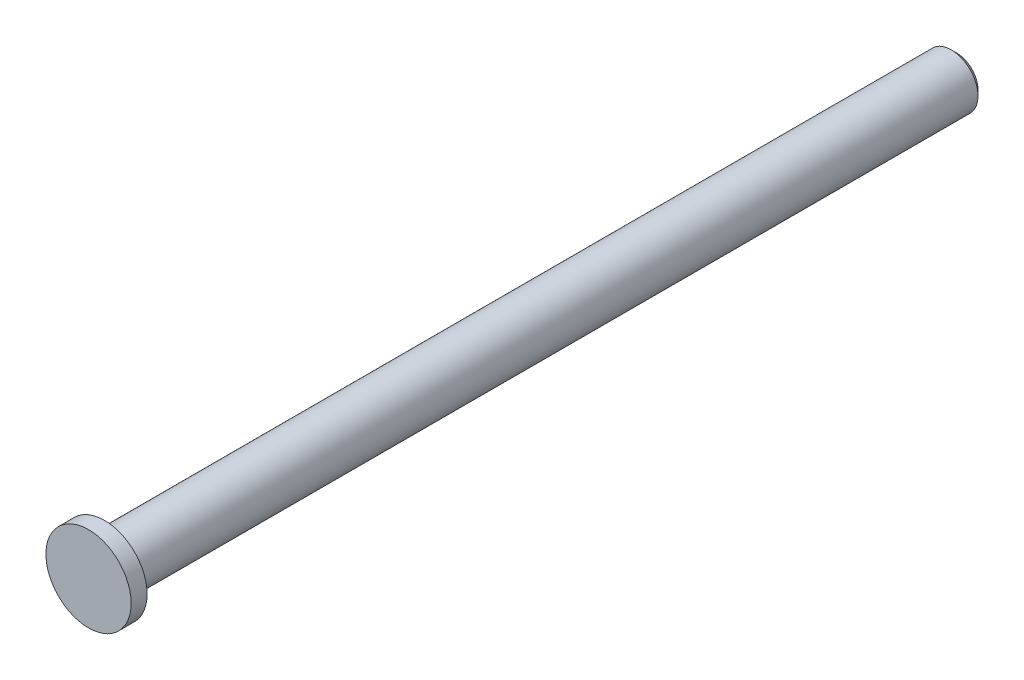
ISO-10303-21;
HEADER;
FILE_DESCRIPTION(('STEP AP214'),'2;1');
FILE_NAME('part.step','',(''),(''),'','','');
FILE_SCHEMA(('AUTOMOTIVE_DESIGN { 1 0 10303 214 1 1 1 1 }'));
ENDSEC;
DATA;
#1=APPLICATION_CONTEXT('core data for automotive mechanical design processes');
#2=APPLICATION_PROTOCOL_DEFINITION('international standard','automotive_design',2000,#1);
#3=PRODUCT_CONTEXT('',#1,'mechanical');
#4=PRODUCT('Part','Part','',(#3));
#5=PRODUCT_RELATED_PRODUCT_CATEGORY('part','',(#4));
#6=PRODUCT_DEFINITION_FORMATION('','',#4);
#7=PRODUCT_DEFINITION_CONTEXT('part definition',#1,'design');
#8=PRODUCT_DEFINITION('design','',#6,#7);
#9=PRODUCT_DEFINITION_SHAPE('','',#8);
#10=(LENGTH_UNIT() NAMED_UNIT(*) SI_UNIT(.MILLI.,.METRE.));
#11=(NAMED_UNIT(*) PLANE_ANGLE_UNIT() SI_UNIT($,.RADIAN.));
#12=(NAMED_UNIT(*) SI_UNIT($,.STERADIAN.) SOLID_ANGLE_UNIT());
#13=UNCERTAINTY_MEASURE_WITH_UNIT(LENGTH_MEASURE(1.E-05),#10,'distance_accuracy_value','');
#14=(GEOMETRIC_REPRESENTATION_CONTEXT(3) GLOBAL_UNCERTAINTY_ASSIGNED_CONTEXT((#13)) GLOBAL_UNIT_ASSIGNED_CONTEXT((#10,
#11,#12)) REPRESENTATION_CONTEXT('',''));
#15=CARTESIAN_POINT('',(0.,0.,0.));
#16=DIRECTION('',(0.,0.,1.));
#17=DIRECTION('',(1.,0.,0.));
#18=AXIS2_PLACEMENT_3D('',#15,#16,#17);
#19=CARTESIAN_POINT('',(0.,0.,1.5));
#20=DIRECTION('',(0.,0.,-1.));
#21=DIRECTION('',(-1.,0.,0.));
#22=AXIS2_PLACEMENT_3D('',#19,#20,#21);
#23=CYLINDRICAL_SURFACE('',#22,4.);
#24=CARTESIAN_POINT('',(0.,0.,1.5));
#25=DIRECTION('',(0.,0.,1.));
#26=DIRECTION('',(1.,0.,0.));
#27=AXIS2_PLACEMENT_3D('',#24,#25,#26);
#28=CIRCLE('',#27,4.);
#29=CARTESIAN_POINT('',(4.,0.,1.5));
#30=VERTEX_POINT('',#29);
#31=EDGE_CURVE('E55',#30,#30,#28,.T.);
#32=ORIENTED_EDGE('',*,*,#31,.F.);
#33=EDGE_LOOP('',(#32));
#34=FACE_BOUND('',#33,.T.);
#35=CARTESIAN_POINT('',(0.,0.,0.));
#36=DIRECTION('',(0.,0.,1.));
#37=DIRECTION('',(1.,0.,0.));
#38=AXIS2_PLACEMENT_3D('',#35,#36,#37);
#39=CIRCLE('',#38,4.);
#40=CARTESIAN_POINT('',(4.,0.,0.));
#41=VERTEX_POINT('',#40);
#42=EDGE_CURVE('E58',#41,#41,#39,.T.);
#43=ORIENTED_EDGE('',*,*,#42,.T.);
#44=EDGE_LOOP('',(#43));
#45=FACE_BOUND('',#44,.T.);
#46=ADVANCED_FACE('F39',(#34,#45),#23,.T.);
#47=CARTESIAN_POINT('',(0.,0.,1.5));
#48=DIRECTION('',(0.,0.,1.));
#49=DIRECTION('',(1.,0.,0.));
#50=AXIS2_PLACEMENT_3D('',#47,#48,#49);
#51=PLANE('',#50);
#52=ORIENTED_EDGE('',*,*,#31,.T.);
#53=EDGE_LOOP('',(#52));
#54=FACE_BOUND('',#53,.T.);
#55=ADVANCED_FACE('F64',(#54),#51,.T.);
#56=CARTESIAN_POINT('',(0.,0.,0.));
#57=DIRECTION('',(0.,0.,1.));
#58=DIRECTION('',(1.,0.,0.));
#59=AXIS2_PLACEMENT_3D('',#56,#57,#58);
#60=PLANE('',#59);
#61=CARTESIAN_POINT('',(0.,0.,0.));
#62=DIRECTION('',(0.,0.,-1.));
#63=DIRECTION('',(-1.,0.,0.));
#64=AXIS2_PLACEMENT_3D('',#61,#62,#63);
#65=CIRCLE('',#64,2.5);
#66=CARTESIAN_POINT('',(-2.5,0.,0.));
#67=VERTEX_POINT('',#66);
#68=EDGE_CURVE('E51',#67,#67,#65,.T.);
#69=ORIENTED_EDGE('',*,*,#68,.F.);
#70=EDGE_LOOP('',(#69));
#71=FACE_BOUND('',#70,.T.);
#72=ORIENTED_EDGE('',*,*,#42,.F.);
#73=EDGE_LOOP('',(#72));
#74=FACE_BOUND('',#73,.T.);
#75=ADVANCED_FACE('F70',(#71,#74),#60,.F.);
#76=CARTESIAN_POINT('',(0.,0.,-80.));
#77=DIRECTION('',(0.,0.,1.));
#78=DIRECTION('',(1.,0.,0.));
#79=AXIS2_PLACEMENT_3D('',#76,#77,#78);
#80=CYLINDRICAL_SURFACE('',#79,2.5);
#81=CARTESIAN_POINT('',(0.,0.,-79.5));
#82=DIRECTION('',(0.,0.,-1.));
#83=DIRECTION('',(-1.,0.,0.));
#84=AXIS2_PLACEMENT_3D('',#81,#82,#83);
#85=CIRCLE('',#84,2.5);
#86=CARTESIAN_POINT('',(-2.5,0.,-79.5));
#87=VERTEX_POINT('',#86);
#88=EDGE_CURVE('E10',#87,#87,#85,.F.);
#89=ORIENTED_EDGE('',*,*,#88,.T.);
#90=EDGE_LOOP('',(#89));
#91=FACE_BOUND('',#90,.T.);
#92=ORIENTED_EDGE('',*,*,#68,.T.);
#93=EDGE_LOOP('',(#92));
#94=FACE_BOUND('',#93,.T.);
#95=ADVANCED_FACE('F72',(#91,#94),#80,.T.);
#96=CARTESIAN_POINT('',(0.,0.,-80.));
#97=DIRECTION('',(0.,0.,-1.));
#98=DIRECTION('',(-1.,0.,0.));
#99=AXIS2_PLACEMENT_3D('',#96,#97,#98);
#100=PLANE('',#99);
#101=CARTESIAN_POINT('',(0.,0.,-80.));
#102=DIRECTION('',(0.,0.,-1.));
#103=DIRECTION('',(-1.,0.,0.));
#104=AXIS2_PLACEMENT_3D('',#101,#102,#103);
#105=CIRCLE('',#104,1.99999999999999);
#106=CARTESIAN_POINT('',(-1.99999999999999,0.,-80.));
#107=VERTEX_POINT('',#106);
#108=EDGE_CURVE('E47',#107,#107,#105,.T.);
#109=ORIENTED_EDGE('',*,*,#108,.T.);
#110=EDGE_LOOP('',(#109));
#111=FACE_BOUND('',#110,.T.);
#112=ADVANCED_FACE('F79',(#111),#100,.T.);
#113=CARTESIAN_POINT('',(0.,0.,-80.));
#114=DIRECTION('',(0.,0.,1.));
#115=DIRECTION('',(1.,0.,0.));
#116=AXIS2_PLACEMENT_3D('',#113,#114,#115);
#117=CONICAL_SURFACE('',#116,1.99999999999999,0.785398163397467);
#118=ORIENTED_EDGE('',*,*,#88,.F.);
#119=EDGE_LOOP('',(#118));
#120=FACE_BOUND('',#119,.T.);
#121=ORIENTED_EDGE('',*,*,#108,.F.);
#122=EDGE_LOOP('',(#121));
#123=FACE_BOUND('',#122,.T.);
#124=ADVANCED_FACE('F42',(#120,#123),#117,.T.);
#125=CLOSED_SHELL('',(#46,#55,#75,#95,#112,#124));
#126=MANIFOLD_SOLID_BREP('B2',#125);
#127=ADVANCED_BREP_SHAPE_REPRESENTATION('',(#18,#126),#14);
#128=SHAPE_DEFINITION_REPRESENTATION(#9,#127);
ENDSEC;
END-ISO-10303-21;
